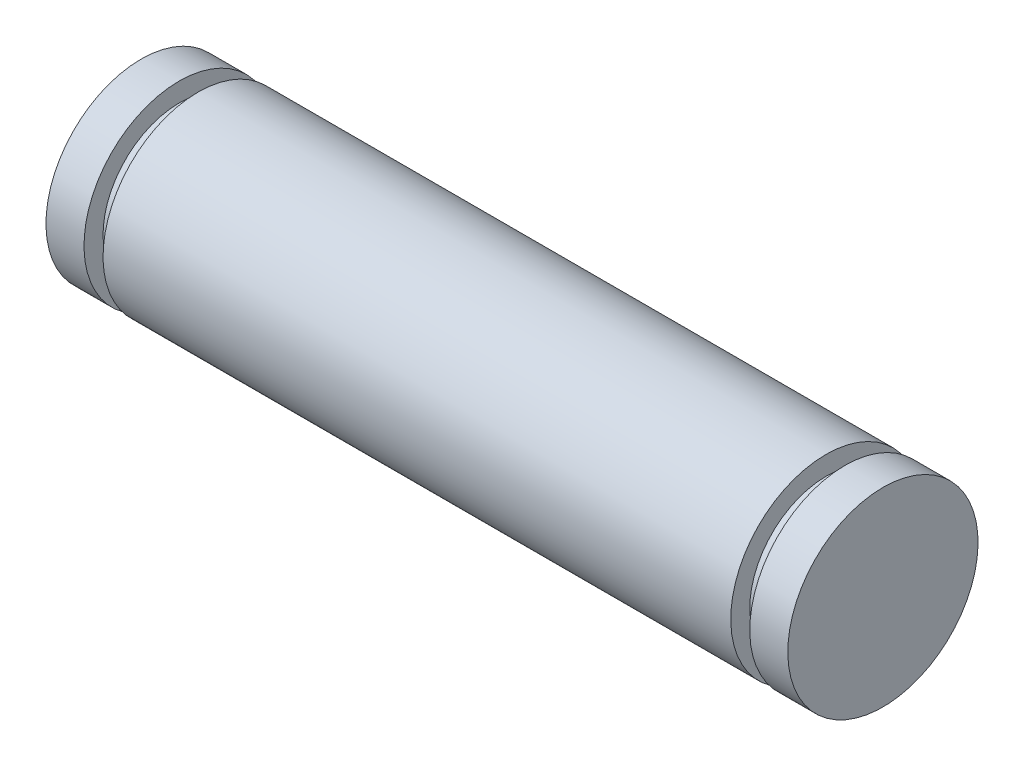
ISO-10303-21;
HEADER;
FILE_DESCRIPTION(('STEP AP214'),'2;1');
FILE_NAME('part.step','',(''),(''),'','','');
FILE_SCHEMA(('AUTOMOTIVE_DESIGN { 1 0 10303 214 1 1 1 1 }'));
ENDSEC;
DATA;
#1=APPLICATION_CONTEXT('core data for automotive mechanical design processes');
#2=APPLICATION_PROTOCOL_DEFINITION('international standard','automotive_design',2000,#1);
#3=PRODUCT_CONTEXT('',#1,'mechanical');
#4=PRODUCT('Part','Part','',(#3));
#5=PRODUCT_RELATED_PRODUCT_CATEGORY('part','',(#4));
#6=PRODUCT_DEFINITION_FORMATION('','',#4);
#7=PRODUCT_DEFINITION_CONTEXT('part definition',#1,'design');
#8=PRODUCT_DEFINITION('design','',#6,#7);
#9=PRODUCT_DEFINITION_SHAPE('','',#8);
#10=(LENGTH_UNIT() NAMED_UNIT(*) SI_UNIT(.MILLI.,.METRE.));
#11=(NAMED_UNIT(*) PLANE_ANGLE_UNIT() SI_UNIT($,.RADIAN.));
#12=(NAMED_UNIT(*) SI_UNIT($,.STERADIAN.) SOLID_ANGLE_UNIT());
#13=UNCERTAINTY_MEASURE_WITH_UNIT(LENGTH_MEASURE(1.E-05),#10,'distance_accuracy_value','');
#14=(GEOMETRIC_REPRESENTATION_CONTEXT(3) GLOBAL_UNCERTAINTY_ASSIGNED_CONTEXT((#13)) GLOBAL_UNIT_ASSIGNED_CONTEXT((#10,
#11,#12)) REPRESENTATION_CONTEXT('',''));
#15=CARTESIAN_POINT('',(0.,0.,0.));
#16=DIRECTION('',(0.,0.,1.));
#17=DIRECTION('',(1.,0.,0.));
#18=AXIS2_PLACEMENT_3D('',#15,#16,#17);
#19=CARTESIAN_POINT('',(-19.5,0.,0.));
#20=DIRECTION('',(-1.,0.,0.));
#21=DIRECTION('',(0.,-1.,0.));
#22=AXIS2_PLACEMENT_3D('',#19,#20,#21);
#23=PLANE('',#22);
#24=CARTESIAN_POINT('',(-19.5,0.,0.));
#25=DIRECTION('',(1.,0.,0.));
#26=DIRECTION('',(0.,1.,0.));
#27=AXIS2_PLACEMENT_3D('',#24,#25,#26);
#28=CIRCLE('',#27,2.5);
#29=CARTESIAN_POINT('',(-19.5,2.5,0.));
#30=VERTEX_POINT('',#29);
#31=EDGE_CURVE('E10',#30,#30,#28,.T.);
#32=ORIENTED_EDGE('',*,*,#31,.F.);
#33=EDGE_LOOP('',(#32));
#34=FACE_BOUND('',#33,.T.);
#35=ADVANCED_FACE('F37',(#34),#23,.T.);
#36=CARTESIAN_POINT('',(0.,0.,0.));
#37=DIRECTION('',(1.,0.,0.));
#38=DIRECTION('',(0.,1.,0.));
#39=AXIS2_PLACEMENT_3D('',#36,#37,#38);
#40=CYLINDRICAL_SURFACE('',#39,2.5);
#41=ORIENTED_EDGE('',*,*,#31,.T.);
#42=EDGE_LOOP('',(#41));
#43=FACE_BOUND('',#42,.T.);
#44=CARTESIAN_POINT('',(-18.5,0.,0.));
#45=DIRECTION('',(1.,0.,0.));
#46=DIRECTION('',(0.,1.,0.));
#47=AXIS2_PLACEMENT_3D('',#44,#45,#46);
#48=CIRCLE('',#47,2.5);
#49=CARTESIAN_POINT('',(-18.5,2.5,0.));
#50=VERTEX_POINT('',#49);
#51=EDGE_CURVE('E44',#50,#50,#48,.T.);
#52=ORIENTED_EDGE('',*,*,#51,.F.);
#53=EDGE_LOOP('',(#52));
#54=FACE_BOUND('',#53,.T.);
#55=ADVANCED_FACE('F101',(#43,#54),#40,.T.);
#56=CARTESIAN_POINT('',(-18.5,2.5,0.));
#57=DIRECTION('',(1.,0.,0.));
#58=DIRECTION('',(0.,1.,0.));
#59=AXIS2_PLACEMENT_3D('',#56,#57,#58);
#60=PLANE('',#59);
#61=ORIENTED_EDGE('',*,*,#51,.T.);
#62=EDGE_LOOP('',(#61));
#63=FACE_BOUND('',#62,.T.);
#64=CARTESIAN_POINT('',(-18.5,0.,0.));
#65=DIRECTION('',(1.,0.,0.));
#66=DIRECTION('',(0.,1.,0.));
#67=AXIS2_PLACEMENT_3D('',#64,#65,#66);
#68=CIRCLE('',#67,2.);
#69=CARTESIAN_POINT('',(-18.5,2.,0.));
#70=VERTEX_POINT('',#69);
#71=EDGE_CURVE('E49',#70,#70,#68,.T.);
#72=ORIENTED_EDGE('',*,*,#71,.F.);
#73=EDGE_LOOP('',(#72));
#74=FACE_BOUND('',#73,.T.);
#75=ADVANCED_FACE('F106',(#63,#74),#60,.T.);
#76=CARTESIAN_POINT('',(0.,0.,0.));
#77=DIRECTION('',(1.,0.,0.));
#78=DIRECTION('',(0.,1.,0.));
#79=AXIS2_PLACEMENT_3D('',#76,#77,#78);
#80=CYLINDRICAL_SURFACE('',#79,2.);
#81=ORIENTED_EDGE('',*,*,#71,.T.);
#82=EDGE_LOOP('',(#81));
#83=FACE_BOUND('',#82,.T.);
#84=CARTESIAN_POINT('',(-18.,0.,0.));
#85=DIRECTION('',(1.,0.,0.));
#86=DIRECTION('',(0.,1.,0.));
#87=AXIS2_PLACEMENT_3D('',#84,#85,#86);
#88=CIRCLE('',#87,2.);
#89=CARTESIAN_POINT('',(-18.,2.,0.));
#90=VERTEX_POINT('',#89);
#91=EDGE_CURVE('E54',#90,#90,#88,.T.);
#92=ORIENTED_EDGE('',*,*,#91,.F.);
#93=EDGE_LOOP('',(#92));
#94=FACE_BOUND('',#93,.T.);
#95=ADVANCED_FACE('F110',(#83,#94),#80,.T.);
#96=CARTESIAN_POINT('',(-18.,2.,0.));
#97=DIRECTION('',(-1.,0.,0.));
#98=DIRECTION('',(0.,-1.,0.));
#99=AXIS2_PLACEMENT_3D('',#96,#97,#98);
#100=PLANE('',#99);
#101=ORIENTED_EDGE('',*,*,#91,.T.);
#102=EDGE_LOOP('',(#101));
#103=FACE_BOUND('',#102,.T.);
#104=CARTESIAN_POINT('',(-18.,0.,0.));
#105=DIRECTION('',(1.,0.,0.));
#106=DIRECTION('',(0.,1.,0.));
#107=AXIS2_PLACEMENT_3D('',#104,#105,#106);
#108=CIRCLE('',#107,2.5);
#109=CARTESIAN_POINT('',(-18.,2.5,0.));
#110=VERTEX_POINT('',#109);
#111=EDGE_CURVE('E60',#110,#110,#108,.T.);
#112=ORIENTED_EDGE('',*,*,#111,.F.);
#113=EDGE_LOOP('',(#112));
#114=FACE_BOUND('',#113,.T.);
#115=ADVANCED_FACE('F116',(#103,#114),#100,.T.);
#116=CARTESIAN_POINT('',(0.,0.,0.));
#117=DIRECTION('',(1.,0.,0.));
#118=DIRECTION('',(0.,1.,0.));
#119=AXIS2_PLACEMENT_3D('',#116,#117,#118);
#120=CYLINDRICAL_SURFACE('',#119,2.5);
#121=ORIENTED_EDGE('',*,*,#111,.T.);
#122=EDGE_LOOP('',(#121));
#123=FACE_BOUND('',#122,.T.);
#124=CARTESIAN_POINT('',(-1.5,0.,0.));
#125=DIRECTION('',(1.,0.,0.));
#126=DIRECTION('',(0.,1.,0.));
#127=AXIS2_PLACEMENT_3D('',#124,#125,#126);
#128=CIRCLE('',#127,2.5);
#129=CARTESIAN_POINT('',(-1.5,2.5,0.));
#130=VERTEX_POINT('',#129);
#131=EDGE_CURVE('E64',#130,#130,#128,.T.);
#132=ORIENTED_EDGE('',*,*,#131,.F.);
#133=EDGE_LOOP('',(#132));
#134=FACE_BOUND('',#133,.T.);
#135=ADVANCED_FACE('F120',(#123,#134),#120,.T.);
#136=CARTESIAN_POINT('',(-1.5,2.5,0.));
#137=DIRECTION('',(1.,0.,0.));
#138=DIRECTION('',(0.,1.,0.));
#139=AXIS2_PLACEMENT_3D('',#136,#137,#138);
#140=PLANE('',#139);
#141=ORIENTED_EDGE('',*,*,#131,.T.);
#142=EDGE_LOOP('',(#141));
#143=FACE_BOUND('',#142,.T.);
#144=CARTESIAN_POINT('',(-1.5,0.,0.));
#145=DIRECTION('',(1.,0.,0.));
#146=DIRECTION('',(0.,1.,0.));
#147=AXIS2_PLACEMENT_3D('',#144,#145,#146);
#148=CIRCLE('',#147,2.);
#149=CARTESIAN_POINT('',(-1.5,2.,0.));
#150=VERTEX_POINT('',#149);
#151=EDGE_CURVE('E68',#150,#150,#148,.T.);
#152=ORIENTED_EDGE('',*,*,#151,.F.);
#153=EDGE_LOOP('',(#152));
#154=FACE_BOUND('',#153,.T.);
#155=ADVANCED_FACE('F124',(#143,#154),#140,.T.);
#156=CARTESIAN_POINT('',(0.,0.,0.));
#157=DIRECTION('',(1.,0.,0.));
#158=DIRECTION('',(0.,1.,0.));
#159=AXIS2_PLACEMENT_3D('',#156,#157,#158);
#160=CYLINDRICAL_SURFACE('',#159,2.);
#161=ORIENTED_EDGE('',*,*,#151,.T.);
#162=EDGE_LOOP('',(#161));
#163=FACE_BOUND('',#162,.T.);
#164=CARTESIAN_POINT('',(-0.999999999999998,0.,0.));
#165=DIRECTION('',(1.,0.,0.));
#166=DIRECTION('',(0.,1.,0.));
#167=AXIS2_PLACEMENT_3D('',#164,#165,#166);
#168=CIRCLE('',#167,2.);
#169=CARTESIAN_POINT('',(-0.999999999999998,2.,0.));
#170=VERTEX_POINT('',#169);
#171=EDGE_CURVE('E72',#170,#170,#168,.T.);
#172=ORIENTED_EDGE('',*,*,#171,.F.);
#173=EDGE_LOOP('',(#172));
#174=FACE_BOUND('',#173,.T.);
#175=ADVANCED_FACE('F97',(#163,#174),#160,.T.);
#176=CARTESIAN_POINT('',(-0.999999999999998,2.,0.));
#177=DIRECTION('',(-1.,0.,0.));
#178=DIRECTION('',(0.,-1.,0.));
#179=AXIS2_PLACEMENT_3D('',#176,#177,#178);
#180=PLANE('',#179);
#181=ORIENTED_EDGE('',*,*,#171,.T.);
#182=EDGE_LOOP('',(#181));
#183=FACE_BOUND('',#182,.T.);
#184=CARTESIAN_POINT('',(-0.999999999999998,0.,0.));
#185=DIRECTION('',(1.,0.,0.));
#186=DIRECTION('',(0.,1.,0.));
#187=AXIS2_PLACEMENT_3D('',#184,#185,#186);
#188=CIRCLE('',#187,2.5);
#189=CARTESIAN_POINT('',(-0.999999999999998,2.5,0.));
#190=VERTEX_POINT('',#189);
#191=EDGE_CURVE('E76',#190,#190,#188,.T.);
#192=ORIENTED_EDGE('',*,*,#191,.F.);
#193=EDGE_LOOP('',(#192));
#194=FACE_BOUND('',#193,.T.);
#195=ADVANCED_FACE('F89',(#183,#194),#180,.T.);
#196=CARTESIAN_POINT('',(0.,0.,0.));
#197=DIRECTION('',(1.,0.,0.));
#198=DIRECTION('',(0.,1.,0.));
#199=AXIS2_PLACEMENT_3D('',#196,#197,#198);
#200=CYLINDRICAL_SURFACE('',#199,2.5);
#201=ORIENTED_EDGE('',*,*,#191,.T.);
#202=EDGE_LOOP('',(#201));
#203=FACE_BOUND('',#202,.T.);
#204=CARTESIAN_POINT('',(0.,0.,0.));
#205=DIRECTION('',(1.,0.,0.));
#206=DIRECTION('',(0.,1.,0.));
#207=AXIS2_PLACEMENT_3D('',#204,#205,#206);
#208=CIRCLE('',#207,2.5);
#209=CARTESIAN_POINT('',(0.,2.5,0.));
#210=VERTEX_POINT('',#209);
#211=EDGE_CURVE('E80',#210,#210,#208,.T.);
#212=ORIENTED_EDGE('',*,*,#211,.F.);
#213=EDGE_LOOP('',(#212));
#214=FACE_BOUND('',#213,.T.);
#215=ADVANCED_FACE('F87',(#203,#214),#200,.T.);
#216=CARTESIAN_POINT('',(0.,2.5,0.));
#217=DIRECTION('',(1.,0.,0.));
#218=DIRECTION('',(0.,1.,0.));
#219=AXIS2_PLACEMENT_3D('',#216,#217,#218);
#220=PLANE('',#219);
#221=ORIENTED_EDGE('',*,*,#211,.T.);
#222=EDGE_LOOP('',(#221));
#223=FACE_BOUND('',#222,.T.);
#224=ADVANCED_FACE('F85',(#223),#220,.T.);
#225=CLOSED_SHELL('',(#35,#55,#75,#95,#115,#135,#155,#175,#195,#215,#224));
#226=MANIFOLD_SOLID_BREP('B2',#225);
#227=ADVANCED_BREP_SHAPE_REPRESENTATION('',(#18,#226),#14);
#228=SHAPE_DEFINITION_REPRESENTATION(#9,#227);
ENDSEC;
END-ISO-10303-21;
